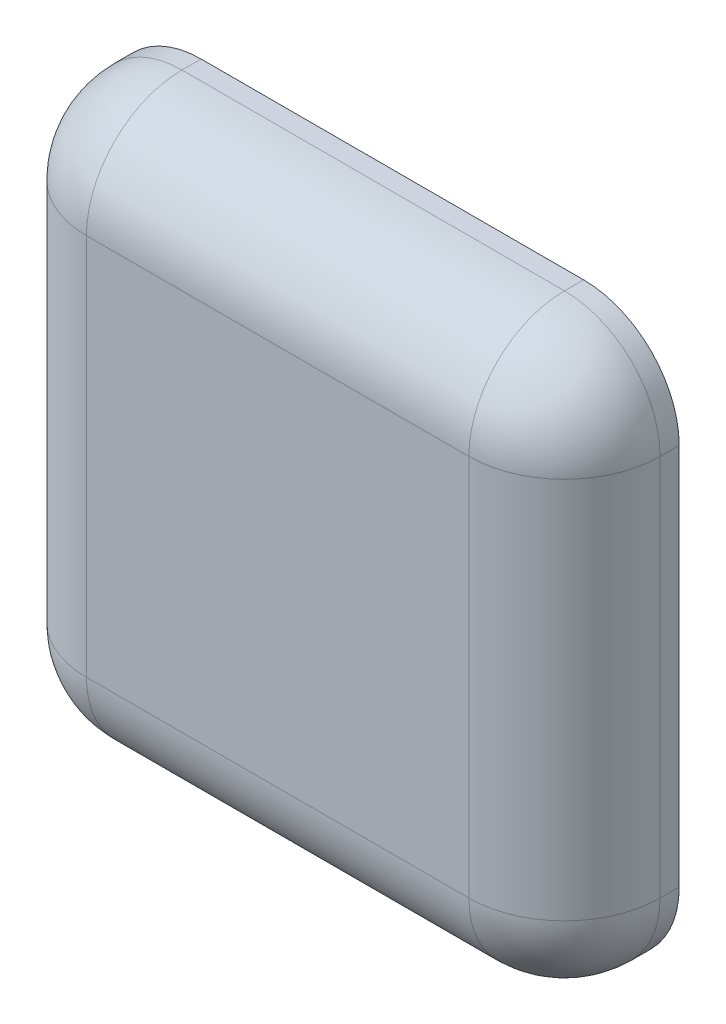
ISO-10303-21;
HEADER;
FILE_DESCRIPTION(('STEP AP214'),'2;1');
FILE_NAME('part.step','',(''),(''),'','','');
FILE_SCHEMA(('AUTOMOTIVE_DESIGN { 1 0 10303 214 1 1 1 1 }'));
ENDSEC;
DATA;
#1=APPLICATION_CONTEXT('core data for automotive mechanical design processes');
#2=APPLICATION_PROTOCOL_DEFINITION('international standard','automotive_design',2000,#1);
#3=PRODUCT_CONTEXT('',#1,'mechanical');
#4=PRODUCT('Part','Part','',(#3));
#5=PRODUCT_RELATED_PRODUCT_CATEGORY('part','',(#4));
#6=PRODUCT_DEFINITION_FORMATION('','',#4);
#7=PRODUCT_DEFINITION_CONTEXT('part definition',#1,'design');
#8=PRODUCT_DEFINITION('design','',#6,#7);
#9=PRODUCT_DEFINITION_SHAPE('','',#8);
#10=(LENGTH_UNIT() NAMED_UNIT(*) SI_UNIT(.MILLI.,.METRE.));
#11=(NAMED_UNIT(*) PLANE_ANGLE_UNIT() SI_UNIT($,.RADIAN.));
#12=(NAMED_UNIT(*) SI_UNIT($,.STERADIAN.) SOLID_ANGLE_UNIT());
#13=UNCERTAINTY_MEASURE_WITH_UNIT(LENGTH_MEASURE(1.E-05),#10,'distance_accuracy_value','');
#14=(GEOMETRIC_REPRESENTATION_CONTEXT(3) GLOBAL_UNCERTAINTY_ASSIGNED_CONTEXT((#13)) GLOBAL_UNIT_ASSIGNED_CONTEXT((#10,
#11,#12)) REPRESENTATION_CONTEXT('',''));
#15=CARTESIAN_POINT('',(0.,0.,0.));
#16=DIRECTION('',(0.,0.,1.));
#17=DIRECTION('',(1.,0.,0.));
#18=AXIS2_PLACEMENT_3D('',#15,#16,#17);
#19=CARTESIAN_POINT('',(218.518518518519,117.592592592593,60.));
#20=DIRECTION('',(0.,-1.,0.));
#21=DIRECTION('',(1.,0.,0.));
#22=AXIS2_PLACEMENT_3D('',#19,#20,#21);
#23=PLANE('',#22);
#24=DIRECTION('',(-1.,0.,0.));
#25=VECTOR('',#24,1.);
#26=CARTESIAN_POINT('',(218.518518518519,117.592592592593,0.));
#27=LINE('',#26,#25);
#28=CARTESIAN_POINT('',(168.518518518519,117.592592592593,0.));
#29=VERTEX_POINT('',#28);
#30=CARTESIAN_POINT('',(-31.4814814814814,117.592592592593,0.));
#31=VERTEX_POINT('',#30);
#32=EDGE_CURVE('E171',#29,#31,#27,.T.);
#33=ORIENTED_EDGE('',*,*,#32,.T.);
#34=DIRECTION('',(0.,0.,-1.));
#35=VECTOR('',#34,1.);
#36=CARTESIAN_POINT('',(-31.4814814814814,117.592592592593,60.));
#37=LINE('',#36,#35);
#38=CARTESIAN_POINT('',(-31.4814814814814,117.592592592593,9.99999999999999));
#39=VERTEX_POINT('',#38);
#40=EDGE_CURVE('E218',#31,#39,#37,.F.);
#41=ORIENTED_EDGE('',*,*,#40,.T.);
#42=DIRECTION('',(-1.,0.,0.));
#43=VECTOR('',#42,1.);
#44=CARTESIAN_POINT('',(218.518518518519,117.592592592593,9.99999999999999));
#45=LINE('',#44,#43);
#46=CARTESIAN_POINT('',(168.518518518519,117.592592592593,9.99999999999999));
#47=VERTEX_POINT('',#46);
#48=EDGE_CURVE('E152',#39,#47,#45,.F.);
#49=ORIENTED_EDGE('',*,*,#48,.T.);
#50=DIRECTION('',(0.,0.,-1.));
#51=VECTOR('',#50,1.);
#52=CARTESIAN_POINT('',(168.518518518519,117.592592592593,60.));
#53=LINE('',#52,#51);
#54=EDGE_CURVE('E213',#47,#29,#53,.T.);
#55=ORIENTED_EDGE('',*,*,#54,.T.);
#56=EDGE_LOOP('',(#33,#41,#49,#55));
#57=FACE_BOUND('',#56,.T.);
#58=ADVANCED_FACE('F39',(#57),#23,.F.);
#59=CARTESIAN_POINT('',(-81.4814814814815,117.592592592593,60.));
#60=DIRECTION('',(1.,0.,0.));
#61=DIRECTION('',(0.,1.,0.));
#62=AXIS2_PLACEMENT_3D('',#59,#60,#61);
#63=PLANE('',#62);
#64=DIRECTION('',(0.,-1.,0.));
#65=VECTOR('',#64,1.);
#66=CARTESIAN_POINT('',(-81.4814814814815,117.592592592593,0.));
#67=LINE('',#66,#65);
#68=CARTESIAN_POINT('',(-81.4814814814814,67.5925925925926,0.));
#69=VERTEX_POINT('',#68);
#70=CARTESIAN_POINT('',(-81.4814814814814,-132.407407407407,0.));
#71=VERTEX_POINT('',#70);
#72=EDGE_CURVE('E175',#69,#71,#67,.T.);
#73=ORIENTED_EDGE('',*,*,#72,.T.);
#74=DIRECTION('',(0.,0.,-1.));
#75=VECTOR('',#74,1.);
#76=CARTESIAN_POINT('',(-81.4814814814814,-132.407407407407,60.));
#77=LINE('',#76,#75);
#78=CARTESIAN_POINT('',(-81.4814814814814,-132.407407407407,9.99999999999999));
#79=VERTEX_POINT('',#78);
#80=EDGE_CURVE('E57',#71,#79,#77,.F.);
#81=ORIENTED_EDGE('',*,*,#80,.T.);
#82=DIRECTION('',(0.,-1.,0.));
#83=VECTOR('',#82,1.);
#84=CARTESIAN_POINT('',(-81.4814814814815,117.592592592593,9.99999999999999));
#85=LINE('',#84,#83);
#86=CARTESIAN_POINT('',(-81.4814814814814,67.5925925925926,9.99999999999999));
#87=VERTEX_POINT('',#86);
#88=EDGE_CURVE('E61',#79,#87,#85,.F.);
#89=ORIENTED_EDGE('',*,*,#88,.T.);
#90=DIRECTION('',(0.,0.,-1.));
#91=VECTOR('',#90,1.);
#92=CARTESIAN_POINT('',(-81.4814814814814,67.5925925925926,60.));
#93=LINE('',#92,#91);
#94=EDGE_CURVE('E221',#87,#69,#93,.T.);
#95=ORIENTED_EDGE('',*,*,#94,.T.);
#96=EDGE_LOOP('',(#73,#81,#89,#95));
#97=FACE_BOUND('',#96,.T.);
#98=ADVANCED_FACE('F289',(#97),#63,.F.);
#99=CARTESIAN_POINT('',(-81.4814814814814,-182.407407407407,60.));
#100=DIRECTION('',(0.,1.,0.));
#101=DIRECTION('',(0.,0.,1.));
#102=AXIS2_PLACEMENT_3D('',#99,#100,#101);
#103=PLANE('',#102);
#104=DIRECTION('',(1.,0.,0.));
#105=VECTOR('',#104,1.);
#106=CARTESIAN_POINT('',(-81.4814814814814,-182.407407407407,9.99999999999999));
#107=LINE('',#106,#105);
#108=CARTESIAN_POINT('',(168.518518518519,-182.407407407407,9.99999999999999));
#109=VERTEX_POINT('',#108);
#110=CARTESIAN_POINT('',(-31.4814814814814,-182.407407407407,9.99999999999999));
#111=VERTEX_POINT('',#110);
#112=EDGE_CURVE('E207',#109,#111,#107,.F.);
#113=ORIENTED_EDGE('',*,*,#112,.T.);
#114=DIRECTION('',(0.,0.,-1.));
#115=VECTOR('',#114,1.);
#116=CARTESIAN_POINT('',(-31.4814814814814,-182.407407407407,60.));
#117=LINE('',#116,#115);
#118=CARTESIAN_POINT('',(-31.4814814814814,-182.407407407407,0.));
#119=VERTEX_POINT('',#118);
#120=EDGE_CURVE('E210',#111,#119,#117,.T.);
#121=ORIENTED_EDGE('',*,*,#120,.T.);
#122=DIRECTION('',(1.,0.,0.));
#123=VECTOR('',#122,1.);
#124=CARTESIAN_POINT('',(-81.4814814814814,-182.407407407407,0.));
#125=LINE('',#124,#123);
#126=CARTESIAN_POINT('',(168.518518518519,-182.407407407407,0.));
#127=VERTEX_POINT('',#126);
#128=EDGE_CURVE('E181',#119,#127,#125,.T.);
#129=ORIENTED_EDGE('',*,*,#128,.T.);
#130=DIRECTION('',(0.,0.,-1.));
#131=VECTOR('',#130,1.);
#132=CARTESIAN_POINT('',(168.518518518519,-182.407407407407,60.));
#133=LINE('',#132,#131);
#134=EDGE_CURVE('E204',#127,#109,#133,.F.);
#135=ORIENTED_EDGE('',*,*,#134,.T.);
#136=EDGE_LOOP('',(#113,#121,#129,#135));
#137=FACE_BOUND('',#136,.T.);
#138=ADVANCED_FACE('F292',(#137),#103,.F.);
#139=CARTESIAN_POINT('',(218.518518518519,-182.407407407407,60.));
#140=DIRECTION('',(-1.,0.,0.));
#141=DIRECTION('',(0.,0.,1.));
#142=AXIS2_PLACEMENT_3D('',#139,#140,#141);
#143=PLANE('',#142);
#144=DIRECTION('',(0.,1.,0.));
#145=VECTOR('',#144,1.);
#146=CARTESIAN_POINT('',(218.518518518519,-182.407407407407,0.));
#147=LINE('',#146,#145);
#148=CARTESIAN_POINT('',(218.518518518519,-132.407407407407,0.));
#149=VERTEX_POINT('',#148);
#150=CARTESIAN_POINT('',(218.518518518519,67.5925925925926,0.));
#151=VERTEX_POINT('',#150);
#152=EDGE_CURVE('E140',#149,#151,#147,.T.);
#153=ORIENTED_EDGE('',*,*,#152,.T.);
#154=DIRECTION('',(0.,0.,-1.));
#155=VECTOR('',#154,1.);
#156=CARTESIAN_POINT('',(218.518518518519,67.5925925925926,60.));
#157=LINE('',#156,#155);
#158=CARTESIAN_POINT('',(218.518518518519,67.5925925925926,9.99999999999999));
#159=VERTEX_POINT('',#158);
#160=EDGE_CURVE('E201',#151,#159,#157,.F.);
#161=ORIENTED_EDGE('',*,*,#160,.T.);
#162=DIRECTION('',(0.,1.,0.));
#163=VECTOR('',#162,1.);
#164=CARTESIAN_POINT('',(218.518518518519,-182.407407407407,9.99999999999999));
#165=LINE('',#164,#163);
#166=CARTESIAN_POINT('',(218.518518518519,-132.407407407407,9.99999999999999));
#167=VERTEX_POINT('',#166);
#168=EDGE_CURVE('E197',#159,#167,#165,.F.);
#169=ORIENTED_EDGE('',*,*,#168,.T.);
#170=DIRECTION('',(0.,0.,-1.));
#171=VECTOR('',#170,1.);
#172=CARTESIAN_POINT('',(218.518518518519,-132.407407407407,60.));
#173=LINE('',#172,#171);
#174=EDGE_CURVE('E194',#167,#149,#173,.T.);
#175=ORIENTED_EDGE('',*,*,#174,.T.);
#176=EDGE_LOOP('',(#153,#161,#169,#175));
#177=FACE_BOUND('',#176,.T.);
#178=ADVANCED_FACE('F270',(#177),#143,.F.);
#179=CARTESIAN_POINT('',(0.,0.,60.));
#180=DIRECTION('',(0.,0.,1.));
#181=DIRECTION('',(1.,0.,0.));
#182=AXIS2_PLACEMENT_3D('',#179,#180,#181);
#183=PLANE('',#182);
#184=DIRECTION('',(1.,0.,0.));
#185=VECTOR('',#184,1.);
#186=CARTESIAN_POINT('',(218.518518518519,-132.407407407407,60.));
#187=LINE('',#186,#185);
#188=CARTESIAN_POINT('',(-31.4814814814814,-132.407407407407,60.));
#189=VERTEX_POINT('',#188);
#190=CARTESIAN_POINT('',(168.518518518519,-132.407407407407,60.));
#191=VERTEX_POINT('',#190);
#192=EDGE_CURVE('E128',#189,#191,#187,.T.);
#193=ORIENTED_EDGE('',*,*,#192,.T.);
#194=DIRECTION('',(0.,1.,0.));
#195=VECTOR('',#194,1.);
#196=CARTESIAN_POINT('',(168.518518518519,117.592592592593,60.));
#197=LINE('',#196,#195);
#198=CARTESIAN_POINT('',(168.518518518519,67.5925925925926,60.));
#199=VERTEX_POINT('',#198);
#200=EDGE_CURVE('E123',#191,#199,#197,.T.);
#201=ORIENTED_EDGE('',*,*,#200,.T.);
#202=DIRECTION('',(-1.,0.,0.));
#203=VECTOR('',#202,1.);
#204=CARTESIAN_POINT('',(-81.4814814814815,67.5925925925926,60.));
#205=LINE('',#204,#203);
#206=CARTESIAN_POINT('',(-31.4814814814814,67.5925925925926,60.));
#207=VERTEX_POINT('',#206);
#208=EDGE_CURVE('E117',#199,#207,#205,.T.);
#209=ORIENTED_EDGE('',*,*,#208,.T.);
#210=DIRECTION('',(0.,-1.,0.));
#211=VECTOR('',#210,1.);
#212=CARTESIAN_POINT('',(-31.4814814814814,-182.407407407407,60.));
#213=LINE('',#212,#211);
#214=EDGE_CURVE('E120',#207,#189,#213,.T.);
#215=ORIENTED_EDGE('',*,*,#214,.T.);
#216=EDGE_LOOP('',(#193,#201,#209,#215));
#217=FACE_BOUND('',#216,.T.);
#218=ADVANCED_FACE('F119',(#217),#183,.T.);
#219=CARTESIAN_POINT('',(0.,0.,0.));
#220=DIRECTION('',(0.,0.,1.));
#221=DIRECTION('',(1.,0.,0.));
#222=AXIS2_PLACEMENT_3D('',#219,#220,#221);
#223=PLANE('',#222);
#224=ORIENTED_EDGE('',*,*,#128,.F.);
#225=CARTESIAN_POINT('',(-31.4814814814814,-132.407407407407,0.));
#226=DIRECTION('',(0.,0.,1.));
#227=DIRECTION('',(1.,0.,0.));
#228=AXIS2_PLACEMENT_3D('',#225,#226,#227);
#229=CIRCLE('',#228,50.);
#230=EDGE_CURVE('E11',#119,#71,#229,.F.);
#231=ORIENTED_EDGE('',*,*,#230,.T.);
#232=ORIENTED_EDGE('',*,*,#72,.F.);
#233=CARTESIAN_POINT('',(-31.4814814814814,67.5925925925926,0.));
#234=DIRECTION('',(0.,0.,1.));
#235=DIRECTION('',(1.,0.,0.));
#236=AXIS2_PLACEMENT_3D('',#233,#234,#235);
#237=CIRCLE('',#236,50.);
#238=EDGE_CURVE('E49',#69,#31,#237,.F.);
#239=ORIENTED_EDGE('',*,*,#238,.T.);
#240=ORIENTED_EDGE('',*,*,#32,.F.);
#241=CARTESIAN_POINT('',(168.518518518519,67.5925925925926,0.));
#242=DIRECTION('',(0.,0.,1.));
#243=DIRECTION('',(1.,0.,0.));
#244=AXIS2_PLACEMENT_3D('',#241,#242,#243);
#245=CIRCLE('',#244,50.);
#246=EDGE_CURVE('E231',#29,#151,#245,.F.);
#247=ORIENTED_EDGE('',*,*,#246,.T.);
#248=ORIENTED_EDGE('',*,*,#152,.F.);
#249=CARTESIAN_POINT('',(168.518518518519,-132.407407407407,0.));
#250=DIRECTION('',(0.,0.,1.));
#251=DIRECTION('',(1.,0.,0.));
#252=AXIS2_PLACEMENT_3D('',#249,#250,#251);
#253=CIRCLE('',#252,50.);
#254=EDGE_CURVE('E228',#149,#127,#253,.F.);
#255=ORIENTED_EDGE('',*,*,#254,.T.);
#256=EDGE_LOOP('',(#224,#231,#232,#239,#240,#247,#248,#255));
#257=FACE_BOUND('',#256,.T.);
#258=ADVANCED_FACE('F284',(#257),#223,.F.);
#259=CARTESIAN_POINT('',(-31.4814814814814,-132.407407407407,60.));
#260=DIRECTION('',(0.,0.,-1.));
#261=DIRECTION('',(-1.,0.,0.));
#262=AXIS2_PLACEMENT_3D('',#259,#260,#261);
#263=CYLINDRICAL_SURFACE('',#262,50.);
#264=ORIENTED_EDGE('',*,*,#230,.F.);
#265=ORIENTED_EDGE('',*,*,#120,.F.);
#266=CARTESIAN_POINT('',(-31.4814814814814,-132.407407407407,9.99999999999999));
#267=DIRECTION('',(0.,0.,1.));
#268=DIRECTION('',(1.,0.,0.));
#269=AXIS2_PLACEMENT_3D('',#266,#267,#268);
#270=CIRCLE('',#269,50.);
#271=EDGE_CURVE('E43',#79,#111,#270,.T.);
#272=ORIENTED_EDGE('',*,*,#271,.F.);
#273=ORIENTED_EDGE('',*,*,#80,.F.);
#274=EDGE_LOOP('',(#264,#265,#272,#273));
#275=FACE_BOUND('',#274,.T.);
#276=ADVANCED_FACE('F41',(#275),#263,.T.);
#277=CARTESIAN_POINT('',(-31.4814814814814,0.,9.99999999999999));
#278=DIRECTION('',(0.,1.,0.));
#279=DIRECTION('',(-1.,0.,0.));
#280=AXIS2_PLACEMENT_3D('',#277,#278,#279);
#281=CYLINDRICAL_SURFACE('',#280,50.);
#282=CARTESIAN_POINT('',(-31.4814814814814,67.5925925925926,9.99999999999999));
#283=DIRECTION('',(0.,1.,0.));
#284=DIRECTION('',(-1.,0.,0.));
#285=AXIS2_PLACEMENT_3D('',#282,#283,#284);
#286=CIRCLE('',#285,50.);
#287=EDGE_CURVE('E134',#87,#207,#286,.T.);
#288=ORIENTED_EDGE('',*,*,#287,.F.);
#289=ORIENTED_EDGE('',*,*,#88,.F.);
#290=CARTESIAN_POINT('',(-31.4814814814814,-132.407407407407,9.99999999999999));
#291=DIRECTION('',(0.,-1.,0.));
#292=DIRECTION('',(0.,0.,-1.));
#293=AXIS2_PLACEMENT_3D('',#290,#291,#292);
#294=CIRCLE('',#293,50.);
#295=EDGE_CURVE('E137',#189,#79,#294,.T.);
#296=ORIENTED_EDGE('',*,*,#295,.F.);
#297=ORIENTED_EDGE('',*,*,#214,.F.);
#298=EDGE_LOOP('',(#288,#289,#296,#297));
#299=FACE_BOUND('',#298,.T.);
#300=ADVANCED_FACE('F133',(#299),#281,.T.);
#301=CARTESIAN_POINT('',(-31.4814814814814,67.5925925925926,60.));
#302=DIRECTION('',(0.,0.,-1.));
#303=DIRECTION('',(-1.,0.,0.));
#304=AXIS2_PLACEMENT_3D('',#301,#302,#303);
#305=CYLINDRICAL_SURFACE('',#304,50.);
#306=ORIENTED_EDGE('',*,*,#238,.F.);
#307=ORIENTED_EDGE('',*,*,#94,.F.);
#308=CARTESIAN_POINT('',(-31.4814814814814,67.5925925925926,9.99999999999999));
#309=DIRECTION('',(0.,0.,1.));
#310=DIRECTION('',(1.,0.,0.));
#311=AXIS2_PLACEMENT_3D('',#308,#309,#310);
#312=CIRCLE('',#311,50.);
#313=EDGE_CURVE('E148',#39,#87,#312,.T.);
#314=ORIENTED_EDGE('',*,*,#313,.F.);
#315=ORIENTED_EDGE('',*,*,#40,.F.);
#316=EDGE_LOOP('',(#306,#307,#314,#315));
#317=FACE_BOUND('',#316,.T.);
#318=ADVANCED_FACE('F288',(#317),#305,.T.);
#319=CARTESIAN_POINT('',(-31.4814814814814,-132.407407407407,9.99999999999999));
#320=DIRECTION('',(0.,0.,1.));
#321=DIRECTION('',(1.,0.,0.));
#322=AXIS2_PLACEMENT_3D('',#319,#320,#321);
#323=SPHERICAL_SURFACE('',#322,50.);
#324=ORIENTED_EDGE('',*,*,#295,.T.);
#325=ORIENTED_EDGE('',*,*,#271,.T.);
#326=CARTESIAN_POINT('',(-31.4814814814814,-132.407407407407,9.99999999999999));
#327=DIRECTION('',(-1.,0.,0.));
#328=DIRECTION('',(0.,0.,1.));
#329=AXIS2_PLACEMENT_3D('',#326,#327,#328);
#330=CIRCLE('',#329,50.);
#331=EDGE_CURVE('E154',#189,#111,#330,.F.);
#332=ORIENTED_EDGE('',*,*,#331,.F.);
#333=EDGE_LOOP('',(#324,#325,#332));
#334=FACE_BOUND('',#333,.T.);
#335=ADVANCED_FACE('F322',(#334),#323,.T.);
#336=CARTESIAN_POINT('',(-31.4814814814814,67.5925925925926,9.99999999999999));
#337=DIRECTION('',(0.,0.,1.));
#338=DIRECTION('',(1.,0.,0.));
#339=AXIS2_PLACEMENT_3D('',#336,#337,#338);
#340=SPHERICAL_SURFACE('',#339,50.);
#341=ORIENTED_EDGE('',*,*,#313,.T.);
#342=ORIENTED_EDGE('',*,*,#287,.T.);
#343=CARTESIAN_POINT('',(-31.4814814814814,67.5925925925926,9.99999999999999));
#344=DIRECTION('',(-1.,0.,0.));
#345=DIRECTION('',(0.,0.,1.));
#346=AXIS2_PLACEMENT_3D('',#343,#344,#345);
#347=CIRCLE('',#346,50.);
#348=EDGE_CURVE('E145',#39,#207,#347,.F.);
#349=ORIENTED_EDGE('',*,*,#348,.F.);
#350=EDGE_LOOP('',(#341,#342,#349));
#351=FACE_BOUND('',#350,.T.);
#352=ADVANCED_FACE('F144',(#351),#340,.T.);
#353=CARTESIAN_POINT('',(168.518518518519,-132.407407407407,60.));
#354=DIRECTION('',(0.,0.,-1.));
#355=DIRECTION('',(-1.,0.,0.));
#356=AXIS2_PLACEMENT_3D('',#353,#354,#355);
#357=CYLINDRICAL_SURFACE('',#356,50.);
#358=ORIENTED_EDGE('',*,*,#254,.F.);
#359=ORIENTED_EDGE('',*,*,#174,.F.);
#360=CARTESIAN_POINT('',(168.518518518519,-132.407407407407,9.99999999999999));
#361=DIRECTION('',(0.,0.,1.));
#362=DIRECTION('',(1.,0.,0.));
#363=AXIS2_PLACEMENT_3D('',#360,#361,#362);
#364=CIRCLE('',#363,50.);
#365=EDGE_CURVE('E155',#109,#167,#364,.T.);
#366=ORIENTED_EDGE('',*,*,#365,.F.);
#367=ORIENTED_EDGE('',*,*,#134,.F.);
#368=EDGE_LOOP('',(#358,#359,#366,#367));
#369=FACE_BOUND('',#368,.T.);
#370=ADVANCED_FACE('F266',(#369),#357,.T.);
#371=CARTESIAN_POINT('',(0.,-132.407407407407,9.99999999999999));
#372=DIRECTION('',(-1.,0.,0.));
#373=DIRECTION('',(0.,0.,1.));
#374=AXIS2_PLACEMENT_3D('',#371,#372,#373);
#375=CYLINDRICAL_SURFACE('',#374,50.);
#376=ORIENTED_EDGE('',*,*,#331,.T.);
#377=ORIENTED_EDGE('',*,*,#112,.F.);
#378=CARTESIAN_POINT('',(168.518518518519,-132.407407407407,9.99999999999999));
#379=DIRECTION('',(1.,0.,0.));
#380=DIRECTION('',(0.,0.,-1.));
#381=AXIS2_PLACEMENT_3D('',#378,#379,#380);
#382=CIRCLE('',#381,50.);
#383=EDGE_CURVE('E162',#191,#109,#382,.T.);
#384=ORIENTED_EDGE('',*,*,#383,.F.);
#385=ORIENTED_EDGE('',*,*,#192,.F.);
#386=EDGE_LOOP('',(#376,#377,#384,#385));
#387=FACE_BOUND('',#386,.T.);
#388=ADVANCED_FACE('F260',(#387),#375,.T.);
#389=CARTESIAN_POINT('',(0.,67.5925925925926,9.99999999999999));
#390=DIRECTION('',(1.,0.,0.));
#391=DIRECTION('',(0.,1.,0.));
#392=AXIS2_PLACEMENT_3D('',#389,#390,#391);
#393=CYLINDRICAL_SURFACE('',#392,50.);
#394=ORIENTED_EDGE('',*,*,#348,.T.);
#395=ORIENTED_EDGE('',*,*,#208,.F.);
#396=CARTESIAN_POINT('',(168.518518518519,67.5925925925926,9.99999999999999));
#397=DIRECTION('',(1.,0.,0.));
#398=DIRECTION('',(0.,0.,-1.));
#399=AXIS2_PLACEMENT_3D('',#396,#397,#398);
#400=CIRCLE('',#399,50.);
#401=EDGE_CURVE('E246',#47,#199,#400,.T.);
#402=ORIENTED_EDGE('',*,*,#401,.F.);
#403=ORIENTED_EDGE('',*,*,#48,.F.);
#404=EDGE_LOOP('',(#394,#395,#402,#403));
#405=FACE_BOUND('',#404,.T.);
#406=ADVANCED_FACE('F151',(#405),#393,.T.);
#407=CARTESIAN_POINT('',(168.518518518519,67.5925925925926,60.));
#408=DIRECTION('',(0.,0.,-1.));
#409=DIRECTION('',(-1.,0.,0.));
#410=AXIS2_PLACEMENT_3D('',#407,#408,#409);
#411=CYLINDRICAL_SURFACE('',#410,50.);
#412=ORIENTED_EDGE('',*,*,#246,.F.);
#413=ORIENTED_EDGE('',*,*,#54,.F.);
#414=CARTESIAN_POINT('',(168.518518518519,67.5925925925926,9.99999999999999));
#415=DIRECTION('',(0.,0.,1.));
#416=DIRECTION('',(1.,0.,0.));
#417=AXIS2_PLACEMENT_3D('',#414,#415,#416);
#418=CIRCLE('',#417,50.);
#419=EDGE_CURVE('E242',#159,#47,#418,.T.);
#420=ORIENTED_EDGE('',*,*,#419,.F.);
#421=ORIENTED_EDGE('',*,*,#160,.F.);
#422=EDGE_LOOP('',(#412,#413,#420,#421));
#423=FACE_BOUND('',#422,.T.);
#424=ADVANCED_FACE('F281',(#423),#411,.T.);
#425=CARTESIAN_POINT('',(168.518518518519,-132.407407407407,9.99999999999999));
#426=DIRECTION('',(0.,0.,1.));
#427=DIRECTION('',(1.,0.,0.));
#428=AXIS2_PLACEMENT_3D('',#425,#426,#427);
#429=SPHERICAL_SURFACE('',#428,50.);
#430=ORIENTED_EDGE('',*,*,#383,.T.);
#431=ORIENTED_EDGE('',*,*,#365,.T.);
#432=CARTESIAN_POINT('',(168.518518518519,-132.407407407407,9.99999999999999));
#433=DIRECTION('',(0.,-1.,0.));
#434=DIRECTION('',(0.,0.,-1.));
#435=AXIS2_PLACEMENT_3D('',#432,#433,#434);
#436=CIRCLE('',#435,50.);
#437=EDGE_CURVE('E239',#191,#167,#436,.F.);
#438=ORIENTED_EDGE('',*,*,#437,.F.);
#439=EDGE_LOOP('',(#430,#431,#438));
#440=FACE_BOUND('',#439,.T.);
#441=ADVANCED_FACE('F254',(#440),#429,.T.);
#442=CARTESIAN_POINT('',(168.518518518519,67.5925925925926,9.99999999999999));
#443=DIRECTION('',(0.,0.,1.));
#444=DIRECTION('',(1.,0.,0.));
#445=AXIS2_PLACEMENT_3D('',#442,#443,#444);
#446=SPHERICAL_SURFACE('',#445,50.);
#447=ORIENTED_EDGE('',*,*,#419,.T.);
#448=ORIENTED_EDGE('',*,*,#401,.T.);
#449=CARTESIAN_POINT('',(168.518518518519,67.5925925925926,9.99999999999999));
#450=DIRECTION('',(0.,1.,0.));
#451=DIRECTION('',(0.,0.,1.));
#452=AXIS2_PLACEMENT_3D('',#449,#450,#451);
#453=CIRCLE('',#452,50.);
#454=EDGE_CURVE('E236',#159,#199,#453,.F.);
#455=ORIENTED_EDGE('',*,*,#454,.F.);
#456=EDGE_LOOP('',(#447,#448,#455));
#457=FACE_BOUND('',#456,.T.);
#458=ADVANCED_FACE('F277',(#457),#446,.T.);
#459=CARTESIAN_POINT('',(168.518518518519,0.,9.99999999999999));
#460=DIRECTION('',(0.,-1.,0.));
#461=DIRECTION('',(0.,0.,-1.));
#462=AXIS2_PLACEMENT_3D('',#459,#460,#461);
#463=CYLINDRICAL_SURFACE('',#462,50.);
#464=ORIENTED_EDGE('',*,*,#437,.T.);
#465=ORIENTED_EDGE('',*,*,#168,.F.);
#466=ORIENTED_EDGE('',*,*,#454,.T.);
#467=ORIENTED_EDGE('',*,*,#200,.F.);
#468=EDGE_LOOP('',(#464,#465,#466,#467));
#469=FACE_BOUND('',#468,.T.);
#470=ADVANCED_FACE('F275',(#469),#463,.T.);
#471=CLOSED_SHELL('',(#58,#98,#138,#178,#218,#258,#276,#300,#318,#335,#352,#370,#388,#406,#424,
#441,#458,#470));
#472=MANIFOLD_SOLID_BREP('B2',#471);
#473=ADVANCED_BREP_SHAPE_REPRESENTATION('',(#18,#472),#14);
#474=SHAPE_DEFINITION_REPRESENTATION(#9,#473);
ENDSEC;
END-ISO-10303-21;
